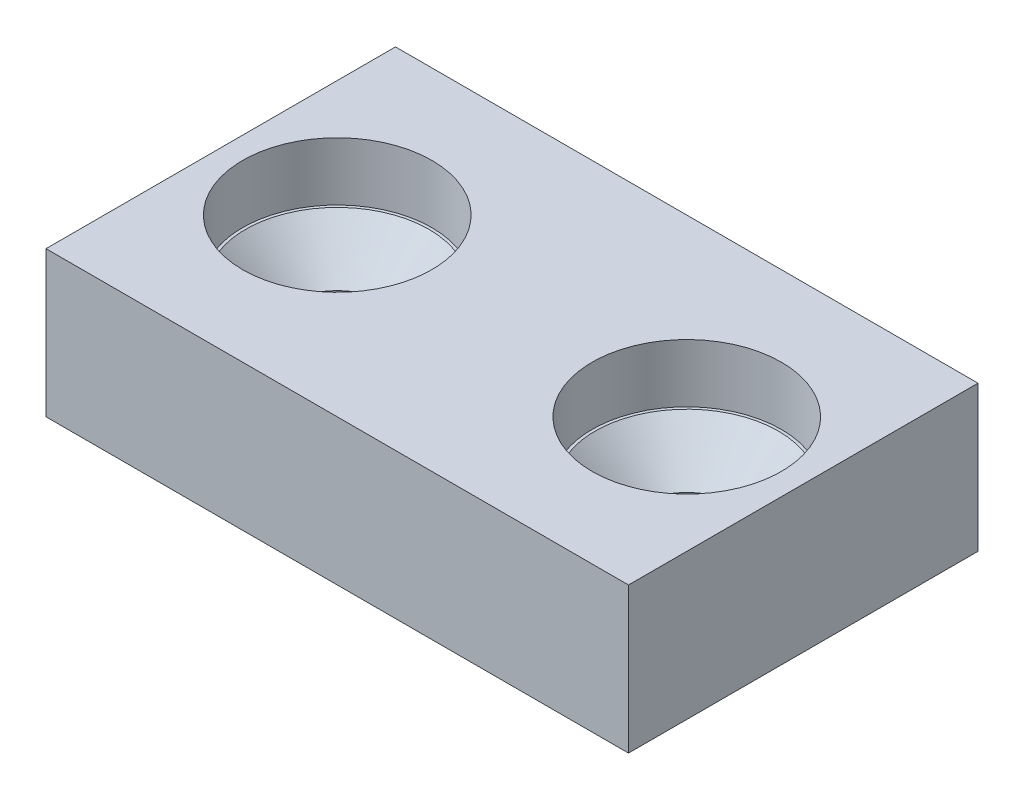
ISO-10303-21;
HEADER;
FILE_DESCRIPTION(('STEP AP214'),'2;1');
FILE_NAME('part.step','',(''),(''),'','','');
FILE_SCHEMA(('AUTOMOTIVE_DESIGN { 1 0 10303 214 1 1 1 1 }'));
ENDSEC;
DATA;
#1=APPLICATION_CONTEXT('core data for automotive mechanical design processes');
#2=APPLICATION_PROTOCOL_DEFINITION('international standard','automotive_design',2000,#1);
#3=PRODUCT_CONTEXT('',#1,'mechanical');
#4=PRODUCT('Part','Part','',(#3));
#5=PRODUCT_RELATED_PRODUCT_CATEGORY('part','',(#4));
#6=PRODUCT_DEFINITION_FORMATION('','',#4);
#7=PRODUCT_DEFINITION_CONTEXT('part definition',#1,'design');
#8=PRODUCT_DEFINITION('design','',#6,#7);
#9=PRODUCT_DEFINITION_SHAPE('','',#8);
#10=(LENGTH_UNIT() NAMED_UNIT(*) SI_UNIT(.MILLI.,.METRE.));
#11=(NAMED_UNIT(*) PLANE_ANGLE_UNIT() SI_UNIT($,.RADIAN.));
#12=(NAMED_UNIT(*) SI_UNIT($,.STERADIAN.) SOLID_ANGLE_UNIT());
#13=UNCERTAINTY_MEASURE_WITH_UNIT(LENGTH_MEASURE(1.E-05),#10,'distance_accuracy_value','');
#14=(GEOMETRIC_REPRESENTATION_CONTEXT(3) GLOBAL_UNCERTAINTY_ASSIGNED_CONTEXT((#13)) GLOBAL_UNIT_ASSIGNED_CONTEXT((#10,
#11,#12)) REPRESENTATION_CONTEXT('',''));
#15=CARTESIAN_POINT('',(0.,0.,0.));
#16=DIRECTION('',(0.,0.,1.));
#17=DIRECTION('',(1.,0.,0.));
#18=AXIS2_PLACEMENT_3D('',#15,#16,#17);
#19=CARTESIAN_POINT('',(16.,5.0012,6.));
#20=DIRECTION('',(0.,-1.,0.));
#21=DIRECTION('',(0.,0.,-1.));
#22=AXIS2_PLACEMENT_3D('',#19,#20,#21);
#23=CYLINDRICAL_SURFACE('',#22,3.25);
#24=CARTESIAN_POINT('',(16.,5.0012,6.));
#25=DIRECTION('',(0.,-1.,0.));
#26=DIRECTION('',(0.,0.,-1.));
#27=AXIS2_PLACEMENT_3D('',#24,#25,#26);
#28=CIRCLE('',#27,3.25);
#29=CARTESIAN_POINT('',(16.,5.0012,2.75));
#30=VERTEX_POINT('',#29);
#31=EDGE_CURVE('E93',#30,#30,#28,.F.);
#32=ORIENTED_EDGE('',*,*,#31,.T.);
#33=EDGE_LOOP('',(#32));
#34=FACE_BOUND('',#33,.T.);
#35=CARTESIAN_POINT('',(16.,3.0012,6.));
#36=DIRECTION('',(0.,-1.,0.));
#37=DIRECTION('',(0.,0.,-1.));
#38=AXIS2_PLACEMENT_3D('',#35,#36,#37);
#39=CIRCLE('',#38,3.25);
#40=CARTESIAN_POINT('',(16.,3.0012,2.75));
#41=VERTEX_POINT('',#40);
#42=EDGE_CURVE('E19',#41,#41,#39,.T.);
#43=ORIENTED_EDGE('',*,*,#42,.T.);
#44=EDGE_LOOP('',(#43));
#45=FACE_BOUND('',#44,.T.);
#46=ADVANCED_FACE('F16',(#34,#45),#23,.F.);
#47=CARTESIAN_POINT('',(4.,5.0012,6.));
#48=DIRECTION('',(0.,-1.,0.));
#49=DIRECTION('',(0.,0.,-1.));
#50=AXIS2_PLACEMENT_3D('',#47,#48,#49);
#51=CYLINDRICAL_SURFACE('',#50,3.25);
#52=CARTESIAN_POINT('',(4.,5.0012,6.));
#53=DIRECTION('',(0.,-1.,0.));
#54=DIRECTION('',(0.,0.,-1.));
#55=AXIS2_PLACEMENT_3D('',#52,#53,#54);
#56=CIRCLE('',#55,3.25);
#57=CARTESIAN_POINT('',(4.,5.0012,2.75));
#58=VERTEX_POINT('',#57);
#59=EDGE_CURVE('E90',#58,#58,#56,.F.);
#60=ORIENTED_EDGE('',*,*,#59,.T.);
#61=EDGE_LOOP('',(#60));
#62=FACE_BOUND('',#61,.T.);
#63=CARTESIAN_POINT('',(4.,3.0012,6.));
#64=DIRECTION('',(0.,-1.,0.));
#65=DIRECTION('',(0.,0.,-1.));
#66=AXIS2_PLACEMENT_3D('',#63,#64,#65);
#67=CIRCLE('',#66,3.25);
#68=CARTESIAN_POINT('',(4.,3.0012,2.75));
#69=VERTEX_POINT('',#68);
#70=EDGE_CURVE('E95',#69,#69,#67,.T.);
#71=ORIENTED_EDGE('',*,*,#70,.T.);
#72=EDGE_LOOP('',(#71));
#73=FACE_BOUND('',#72,.T.);
#74=ADVANCED_FACE('F106',(#62,#73),#51,.F.);
#75=CARTESIAN_POINT('',(16.,3.0012,6.));
#76=DIRECTION('',(0.,-1.,0.));
#77=DIRECTION('',(0.,0.,-1.));
#78=AXIS2_PLACEMENT_3D('',#75,#76,#77);
#79=PLANE('',#78);
#80=CARTESIAN_POINT('',(16.,3.0012000000479,6.));
#81=DIRECTION('',(0.,1.,0.));
#82=DIRECTION('',(0.,0.,1.));
#83=AXIS2_PLACEMENT_3D('',#80,#81,#82);
#84=CIRCLE('',#83,3.15000000006194);
#85=CARTESIAN_POINT('',(16.,3.0012000000479,9.15000000006194));
#86=VERTEX_POINT('',#85);
#87=EDGE_CURVE('E87',#86,#86,#84,.F.);
#88=ORIENTED_EDGE('',*,*,#87,.T.);
#89=EDGE_LOOP('',(#88));
#90=FACE_BOUND('',#89,.T.);
#91=ORIENTED_EDGE('',*,*,#42,.F.);
#92=EDGE_LOOP('',(#91));
#93=FACE_BOUND('',#92,.T.);
#94=ADVANCED_FACE('F103',(#90,#93),#79,.F.);
#95=CARTESIAN_POINT('',(4.,3.0012,6.));
#96=DIRECTION('',(0.,-1.,0.));
#97=DIRECTION('',(0.,0.,-1.));
#98=AXIS2_PLACEMENT_3D('',#95,#96,#97);
#99=PLANE('',#98);
#100=CARTESIAN_POINT('',(4.,3.00120000004745,6.));
#101=DIRECTION('',(0.,1.,0.));
#102=DIRECTION('',(0.,0.,1.));
#103=AXIS2_PLACEMENT_3D('',#100,#101,#102);
#104=CIRCLE('',#103,3.15000000006194);
#105=CARTESIAN_POINT('',(4.,3.00120000004745,9.15000000006194));
#106=VERTEX_POINT('',#105);
#107=EDGE_CURVE('E68',#106,#106,#104,.F.);
#108=ORIENTED_EDGE('',*,*,#107,.T.);
#109=EDGE_LOOP('',(#108));
#110=FACE_BOUND('',#109,.T.);
#111=ORIENTED_EDGE('',*,*,#70,.F.);
#112=EDGE_LOOP('',(#111));
#113=FACE_BOUND('',#112,.T.);
#114=ADVANCED_FACE('F105',(#110,#113),#99,.F.);
#115=CARTESIAN_POINT('',(20.,5.0012,0.));
#116=DIRECTION('',(0.,-1.,0.));
#117=DIRECTION('',(0.,0.,-1.));
#118=AXIS2_PLACEMENT_3D('',#115,#116,#117);
#119=PLANE('',#118);
#120=ORIENTED_EDGE('',*,*,#59,.F.);
#121=EDGE_LOOP('',(#120));
#122=FACE_BOUND('',#121,.T.);
#123=ORIENTED_EDGE('',*,*,#31,.F.);
#124=EDGE_LOOP('',(#123));
#125=FACE_BOUND('',#124,.T.);
#126=DIRECTION('',(1.,0.,0.));
#127=VECTOR('',#126,1.);
#128=CARTESIAN_POINT('',(20.,5.0012,0.));
#129=LINE('',#128,#127);
#130=CARTESIAN_POINT('',(20.,5.0012,0.));
#131=VERTEX_POINT('',#130);
#132=CARTESIAN_POINT('',(0.,5.0012,0.));
#133=VERTEX_POINT('',#132);
#134=EDGE_CURVE('E71',#131,#133,#129,.F.);
#135=ORIENTED_EDGE('',*,*,#134,.T.);
#136=DIRECTION('',(0.,0.,1.));
#137=VECTOR('',#136,1.);
#138=CARTESIAN_POINT('',(0.,5.0012,0.));
#139=LINE('',#138,#137);
#140=CARTESIAN_POINT('',(0.,5.0012,12.));
#141=VERTEX_POINT('',#140);
#142=EDGE_CURVE('E55',#141,#133,#139,.F.);
#143=ORIENTED_EDGE('',*,*,#142,.F.);
#144=DIRECTION('',(1.,0.,0.));
#145=VECTOR('',#144,1.);
#146=CARTESIAN_POINT('',(20.,5.0012,12.));
#147=LINE('',#146,#145);
#148=CARTESIAN_POINT('',(20.,5.0012,12.));
#149=VERTEX_POINT('',#148);
#150=EDGE_CURVE('E60',#149,#141,#147,.F.);
#151=ORIENTED_EDGE('',*,*,#150,.F.);
#152=DIRECTION('',(0.,0.,1.));
#153=VECTOR('',#152,1.);
#154=CARTESIAN_POINT('',(20.,5.0012,0.));
#155=LINE('',#154,#153);
#156=EDGE_CURVE('E257',#149,#131,#155,.F.);
#157=ORIENTED_EDGE('',*,*,#156,.T.);
#158=EDGE_LOOP('',(#135,#143,#151,#157));
#159=FACE_BOUND('',#158,.T.);
#160=ADVANCED_FACE('F70',(#122,#125,#159),#119,.F.);
#161=CARTESIAN_POINT('',(16.,3.00120000002835,6.));
#162=DIRECTION('',(0.,1.,0.));
#163=DIRECTION('',(0.,0.,1.));
#164=AXIS2_PLACEMENT_3D('',#161,#162,#163);
#165=CONICAL_SURFACE('',#164,3.15000000004238,0.785398163417049);
#166=ORIENTED_EDGE('',*,*,#87,.F.);
#167=EDGE_LOOP('',(#166));
#168=FACE_BOUND('',#167,.T.);
#169=CARTESIAN_POINT('',(16.,1.5512,6.));
#170=DIRECTION('',(0.,-1.,0.));
#171=DIRECTION('',(0.,0.,-1.));
#172=AXIS2_PLACEMENT_3D('',#169,#170,#171);
#173=CIRCLE('',#172,1.7);
#174=CARTESIAN_POINT('',(16.,1.5512,4.3));
#175=VERTEX_POINT('',#174);
#176=EDGE_CURVE('E250',#175,#175,#173,.T.);
#177=ORIENTED_EDGE('',*,*,#176,.T.);
#178=EDGE_LOOP('',(#177));
#179=FACE_BOUND('',#178,.T.);
#180=ADVANCED_FACE('F147',(#168,#179),#165,.F.);
#181=CARTESIAN_POINT('',(4.,3.00120000002835,6.));
#182=DIRECTION('',(0.,1.,0.));
#183=DIRECTION('',(0.,0.,1.));
#184=AXIS2_PLACEMENT_3D('',#181,#182,#183);
#185=CONICAL_SURFACE('',#184,3.15000000004284,0.785398163417049);
#186=ORIENTED_EDGE('',*,*,#107,.F.);
#187=EDGE_LOOP('',(#186));
#188=FACE_BOUND('',#187,.T.);
#189=CARTESIAN_POINT('',(4.,1.5512,6.));
#190=DIRECTION('',(0.,-1.,0.));
#191=DIRECTION('',(0.,0.,-1.));
#192=AXIS2_PLACEMENT_3D('',#189,#190,#191);
#193=CIRCLE('',#192,1.7);
#194=CARTESIAN_POINT('',(4.,1.5512,4.3));
#195=VERTEX_POINT('',#194);
#196=EDGE_CURVE('E252',#195,#195,#193,.T.);
#197=ORIENTED_EDGE('',*,*,#196,.T.);
#198=EDGE_LOOP('',(#197));
#199=FACE_BOUND('',#198,.T.);
#200=ADVANCED_FACE('F144',(#188,#199),#185,.F.);
#201=CARTESIAN_POINT('',(20.,5.0012,12.));
#202=DIRECTION('',(0.,0.,1.));
#203=DIRECTION('',(1.,0.,0.));
#204=AXIS2_PLACEMENT_3D('',#201,#202,#203);
#205=PLANE('',#204);
#206=DIRECTION('',(0.,1.,0.));
#207=VECTOR('',#206,1.);
#208=CARTESIAN_POINT('',(20.,5.0012,12.));
#209=LINE('',#208,#207);
#210=CARTESIAN_POINT('',(20.,0.00120000000001832,12.));
#211=VERTEX_POINT('',#210);
#212=EDGE_CURVE('E65',#211,#149,#209,.T.);
#213=ORIENTED_EDGE('',*,*,#212,.T.);
#214=ORIENTED_EDGE('',*,*,#150,.T.);
#215=DIRECTION('',(0.,1.,0.));
#216=VECTOR('',#215,1.);
#217=CARTESIAN_POINT('',(0.,5.0012,12.));
#218=LINE('',#217,#216);
#219=CARTESIAN_POINT('',(0.,0.00120000000001832,12.));
#220=VERTEX_POINT('',#219);
#221=EDGE_CURVE('E62',#220,#141,#218,.T.);
#222=ORIENTED_EDGE('',*,*,#221,.F.);
#223=DIRECTION('',(1.,0.,0.));
#224=VECTOR('',#223,1.);
#225=CARTESIAN_POINT('',(20.,0.00120000000004,12.));
#226=LINE('',#225,#224);
#227=EDGE_CURVE('E255',#211,#220,#226,.F.);
#228=ORIENTED_EDGE('',*,*,#227,.F.);
#229=EDGE_LOOP('',(#213,#214,#222,#228));
#230=FACE_BOUND('',#229,.T.);
#231=ADVANCED_FACE('F61',(#230),#205,.T.);
#232=CARTESIAN_POINT('',(0.,5.0012,0.));
#233=DIRECTION('',(-1.,0.,0.));
#234=DIRECTION('',(0.,0.,1.));
#235=AXIS2_PLACEMENT_3D('',#232,#233,#234);
#236=PLANE('',#235);
#237=ORIENTED_EDGE('',*,*,#142,.T.);
#238=DIRECTION('',(0.,1.,0.));
#239=VECTOR('',#238,1.);
#240=CARTESIAN_POINT('',(0.,5.0012,0.));
#241=LINE('',#240,#239);
#242=CARTESIAN_POINT('',(0.,0.00120000000001832,0.));
#243=VERTEX_POINT('',#242);
#244=EDGE_CURVE('E73',#133,#243,#241,.F.);
#245=ORIENTED_EDGE('',*,*,#244,.T.);
#246=DIRECTION('',(0.,0.,-1.));
#247=VECTOR('',#246,1.);
#248=CARTESIAN_POINT('',(0.,0.00120000000004,0.));
#249=LINE('',#248,#247);
#250=EDGE_CURVE('E77',#220,#243,#249,.T.);
#251=ORIENTED_EDGE('',*,*,#250,.F.);
#252=ORIENTED_EDGE('',*,*,#221,.T.);
#253=EDGE_LOOP('',(#237,#245,#251,#252));
#254=FACE_BOUND('',#253,.T.);
#255=ADVANCED_FACE('F75',(#254),#236,.T.);
#256=CARTESIAN_POINT('',(20.,5.0012,0.));
#257=DIRECTION('',(0.,0.,1.));
#258=DIRECTION('',(1.,0.,0.));
#259=AXIS2_PLACEMENT_3D('',#256,#257,#258);
#260=PLANE('',#259);
#261=DIRECTION('',(0.,1.,0.));
#262=VECTOR('',#261,1.);
#263=CARTESIAN_POINT('',(20.,5.0012,0.));
#264=LINE('',#263,#262);
#265=CARTESIAN_POINT('',(20.,0.00120000000001832,0.));
#266=VERTEX_POINT('',#265);
#267=EDGE_CURVE('E34',#131,#266,#264,.F.);
#268=ORIENTED_EDGE('',*,*,#267,.T.);
#269=DIRECTION('',(1.,0.,0.));
#270=VECTOR('',#269,1.);
#271=CARTESIAN_POINT('',(20.,0.00120000000004,0.));
#272=LINE('',#271,#270);
#273=EDGE_CURVE('E264',#243,#266,#272,.T.);
#274=ORIENTED_EDGE('',*,*,#273,.F.);
#275=ORIENTED_EDGE('',*,*,#244,.F.);
#276=ORIENTED_EDGE('',*,*,#134,.F.);
#277=EDGE_LOOP('',(#268,#274,#275,#276));
#278=FACE_BOUND('',#277,.T.);
#279=ADVANCED_FACE('F136',(#278),#260,.F.);
#280=CARTESIAN_POINT('',(20.,5.0012,0.));
#281=DIRECTION('',(-1.,0.,0.));
#282=DIRECTION('',(0.,0.,1.));
#283=AXIS2_PLACEMENT_3D('',#280,#281,#282);
#284=PLANE('',#283);
#285=ORIENTED_EDGE('',*,*,#156,.F.);
#286=ORIENTED_EDGE('',*,*,#212,.F.);
#287=DIRECTION('',(0.,0.,-1.));
#288=VECTOR('',#287,1.);
#289=CARTESIAN_POINT('',(20.,0.00120000000004,0.));
#290=LINE('',#289,#288);
#291=EDGE_CURVE('E84',#266,#211,#290,.F.);
#292=ORIENTED_EDGE('',*,*,#291,.F.);
#293=ORIENTED_EDGE('',*,*,#267,.F.);
#294=EDGE_LOOP('',(#285,#286,#292,#293));
#295=FACE_BOUND('',#294,.T.);
#296=ADVANCED_FACE('F132',(#295),#284,.F.);
#297=CARTESIAN_POINT('',(16.,5.0012,6.));
#298=DIRECTION('',(0.,-1.,0.));
#299=DIRECTION('',(0.,0.,-1.));
#300=AXIS2_PLACEMENT_3D('',#297,#298,#299);
#301=CYLINDRICAL_SURFACE('',#300,1.7);
#302=CARTESIAN_POINT('',(16.,0.00120000000001109,6.));
#303=DIRECTION('',(0.,-1.,0.));
#304=DIRECTION('',(0.,0.,-1.));
#305=AXIS2_PLACEMENT_3D('',#302,#303,#304);
#306=CIRCLE('',#305,1.7);
#307=CARTESIAN_POINT('',(16.,0.00120000000001109,4.3));
#308=VERTEX_POINT('',#307);
#309=EDGE_CURVE('E25',#308,#308,#306,.F.);
#310=ORIENTED_EDGE('',*,*,#309,.F.);
#311=EDGE_LOOP('',(#310));
#312=FACE_BOUND('',#311,.T.);
#313=ORIENTED_EDGE('',*,*,#176,.F.);
#314=EDGE_LOOP('',(#313));
#315=FACE_BOUND('',#314,.T.);
#316=ADVANCED_FACE('F125',(#312,#315),#301,.F.);
#317=CARTESIAN_POINT('',(4.,5.0012,6.));
#318=DIRECTION('',(0.,-1.,0.));
#319=DIRECTION('',(0.,0.,-1.));
#320=AXIS2_PLACEMENT_3D('',#317,#318,#319);
#321=CYLINDRICAL_SURFACE('',#320,1.7);
#322=CARTESIAN_POINT('',(4.,0.00120000000001109,6.));
#323=DIRECTION('',(0.,-1.,0.));
#324=DIRECTION('',(0.,0.,-1.));
#325=AXIS2_PLACEMENT_3D('',#322,#323,#324);
#326=CIRCLE('',#325,1.7);
#327=CARTESIAN_POINT('',(4.,0.00120000000001109,4.3));
#328=VERTEX_POINT('',#327);
#329=EDGE_CURVE('E11',#328,#328,#326,.F.);
#330=ORIENTED_EDGE('',*,*,#329,.F.);
#331=EDGE_LOOP('',(#330));
#332=FACE_BOUND('',#331,.T.);
#333=ORIENTED_EDGE('',*,*,#196,.F.);
#334=EDGE_LOOP('',(#333));
#335=FACE_BOUND('',#334,.T.);
#336=ADVANCED_FACE('F119',(#332,#335),#321,.F.);
#337=CARTESIAN_POINT('',(20.,0.00120000000004,0.));
#338=DIRECTION('',(0.,-1.,0.));
#339=DIRECTION('',(0.,0.,-1.));
#340=AXIS2_PLACEMENT_3D('',#337,#338,#339);
#341=PLANE('',#340);
#342=ORIENTED_EDGE('',*,*,#329,.T.);
#343=EDGE_LOOP('',(#342));
#344=FACE_BOUND('',#343,.T.);
#345=ORIENTED_EDGE('',*,*,#309,.T.);
#346=EDGE_LOOP('',(#345));
#347=FACE_BOUND('',#346,.T.);
#348=ORIENTED_EDGE('',*,*,#273,.T.);
#349=ORIENTED_EDGE('',*,*,#291,.T.);
#350=ORIENTED_EDGE('',*,*,#227,.T.);
#351=ORIENTED_EDGE('',*,*,#250,.T.);
#352=EDGE_LOOP('',(#348,#349,#350,#351));
#353=FACE_BOUND('',#352,.T.);
#354=ADVANCED_FACE('F117',(#344,#347,#353),#341,.T.);
#355=CLOSED_SHELL('',(#46,#74,#94,#114,#160,#180,#200,#231,#255,#279,#296,#316,#336,#354));
#356=MANIFOLD_SOLID_BREP('B1',#355);
#357=ADVANCED_BREP_SHAPE_REPRESENTATION('',(#18,#356),#14);
#358=SHAPE_DEFINITION_REPRESENTATION(#9,#357);
ENDSEC;
END-ISO-10303-21;
